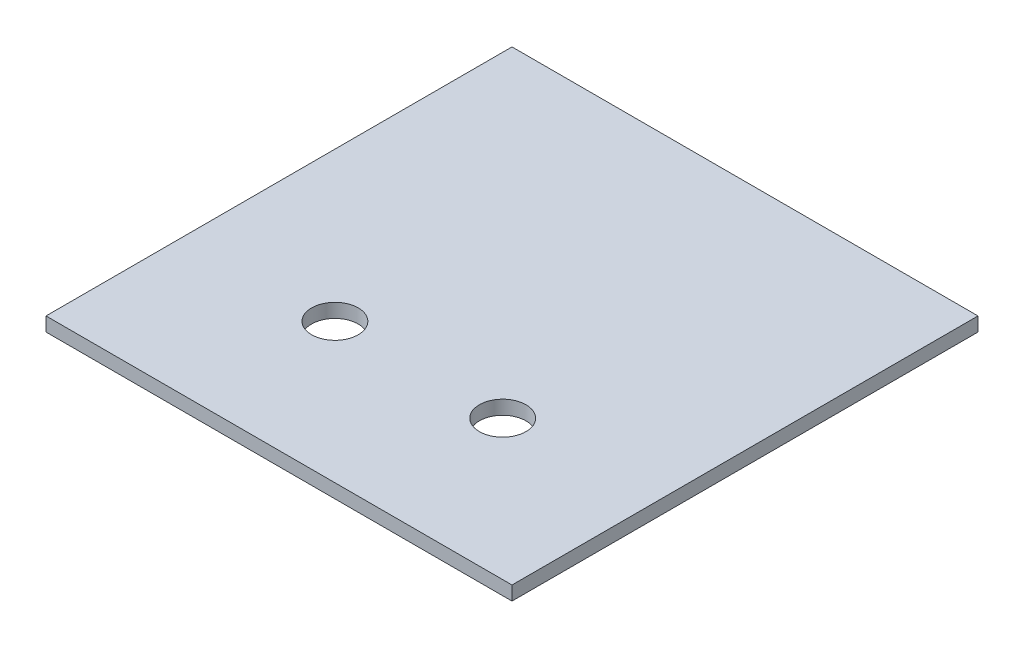
ISO-10303-21;
HEADER;
FILE_DESCRIPTION(('STEP AP214'),'2;1');
FILE_NAME('part.step','',(''),(''),'','','');
FILE_SCHEMA(('AUTOMOTIVE_DESIGN { 1 0 10303 214 1 1 1 1 }'));
ENDSEC;
DATA;
#1=APPLICATION_CONTEXT('core data for automotive mechanical design processes');
#2=APPLICATION_PROTOCOL_DEFINITION('international standard','automotive_design',2000,#1);
#3=PRODUCT_CONTEXT('',#1,'mechanical');
#4=PRODUCT('Part','Part','',(#3));
#5=PRODUCT_RELATED_PRODUCT_CATEGORY('part','',(#4));
#6=PRODUCT_DEFINITION_FORMATION('','',#4);
#7=PRODUCT_DEFINITION_CONTEXT('part definition',#1,'design');
#8=PRODUCT_DEFINITION('design','',#6,#7);
#9=PRODUCT_DEFINITION_SHAPE('','',#8);
#10=(LENGTH_UNIT() NAMED_UNIT(*) SI_UNIT(.MILLI.,.METRE.));
#11=(NAMED_UNIT(*) PLANE_ANGLE_UNIT() SI_UNIT($,.RADIAN.));
#12=(NAMED_UNIT(*) SI_UNIT($,.STERADIAN.) SOLID_ANGLE_UNIT());
#13=UNCERTAINTY_MEASURE_WITH_UNIT(LENGTH_MEASURE(1.E-05),#10,'distance_accuracy_value','');
#14=(GEOMETRIC_REPRESENTATION_CONTEXT(3) GLOBAL_UNCERTAINTY_ASSIGNED_CONTEXT((#13)) GLOBAL_UNIT_ASSIGNED_CONTEXT((#10,
#11,#12)) REPRESENTATION_CONTEXT('',''));
#15=CARTESIAN_POINT('',(0.,0.,0.));
#16=DIRECTION('',(0.,0.,1.));
#17=DIRECTION('',(1.,0.,0.));
#18=AXIS2_PLACEMENT_3D('',#15,#16,#17);
#19=CARTESIAN_POINT('',(25.,1.5,25.));
#20=DIRECTION('',(-1.,0.,0.));
#21=DIRECTION('',(0.,0.,1.));
#22=AXIS2_PLACEMENT_3D('',#19,#20,#21);
#23=PLANE('',#22);
#24=DIRECTION('',(0.,0.,-1.));
#25=VECTOR('',#24,1.);
#26=CARTESIAN_POINT('',(25.,0.,25.));
#27=LINE('',#26,#25);
#28=CARTESIAN_POINT('',(25.,0.,25.));
#29=VERTEX_POINT('',#28);
#30=CARTESIAN_POINT('',(25.,0.,-25.));
#31=VERTEX_POINT('',#30);
#32=EDGE_CURVE('E96',#29,#31,#27,.T.);
#33=ORIENTED_EDGE('',*,*,#32,.T.);
#34=DIRECTION('',(0.,-1.,0.));
#35=VECTOR('',#34,1.);
#36=CARTESIAN_POINT('',(25.,1.5,-25.));
#37=LINE('',#36,#35);
#38=CARTESIAN_POINT('',(25.,1.5,-25.));
#39=VERTEX_POINT('',#38);
#40=EDGE_CURVE('E11',#39,#31,#37,.T.);
#41=ORIENTED_EDGE('',*,*,#40,.F.);
#42=DIRECTION('',(0.,0.,-1.));
#43=VECTOR('',#42,1.);
#44=CARTESIAN_POINT('',(25.,1.5,25.));
#45=LINE('',#44,#43);
#46=CARTESIAN_POINT('',(25.,1.5,25.));
#47=VERTEX_POINT('',#46);
#48=EDGE_CURVE('E84',#47,#39,#45,.T.);
#49=ORIENTED_EDGE('',*,*,#48,.F.);
#50=DIRECTION('',(0.,-1.,0.));
#51=VECTOR('',#50,1.);
#52=CARTESIAN_POINT('',(25.,1.5,25.));
#53=LINE('',#52,#51);
#54=EDGE_CURVE('E92',#47,#29,#53,.T.);
#55=ORIENTED_EDGE('',*,*,#54,.T.);
#56=EDGE_LOOP('',(#33,#41,#49,#55));
#57=FACE_BOUND('',#56,.T.);
#58=ADVANCED_FACE('F33',(#57),#23,.F.);
#59=CARTESIAN_POINT('',(-25.,1.5,-25.));
#60=DIRECTION('',(0.,0.,1.));
#61=DIRECTION('',(1.,0.,0.));
#62=AXIS2_PLACEMENT_3D('',#59,#60,#61);
#63=PLANE('',#62);
#64=DIRECTION('',(-1.,0.,0.));
#65=VECTOR('',#64,1.);
#66=CARTESIAN_POINT('',(-25.,0.,-25.));
#67=LINE('',#66,#65);
#68=CARTESIAN_POINT('',(-25.,0.,-25.));
#69=VERTEX_POINT('',#68);
#70=EDGE_CURVE('E88',#31,#69,#67,.T.);
#71=ORIENTED_EDGE('',*,*,#70,.T.);
#72=DIRECTION('',(0.,-1.,0.));
#73=VECTOR('',#72,1.);
#74=CARTESIAN_POINT('',(-25.,1.5,-25.));
#75=LINE('',#74,#73);
#76=CARTESIAN_POINT('',(-25.,1.5,-25.));
#77=VERTEX_POINT('',#76);
#78=EDGE_CURVE('E41',#77,#69,#75,.T.);
#79=ORIENTED_EDGE('',*,*,#78,.F.);
#80=DIRECTION('',(-1.,0.,0.));
#81=VECTOR('',#80,1.);
#82=CARTESIAN_POINT('',(-25.,1.5,-25.));
#83=LINE('',#82,#81);
#84=EDGE_CURVE('E79',#39,#77,#83,.T.);
#85=ORIENTED_EDGE('',*,*,#84,.F.);
#86=ORIENTED_EDGE('',*,*,#40,.T.);
#87=EDGE_LOOP('',(#71,#79,#85,#86));
#88=FACE_BOUND('',#87,.T.);
#89=ADVANCED_FACE('F87',(#88),#63,.F.);
#90=CARTESIAN_POINT('',(-25.,1.5,25.));
#91=DIRECTION('',(1.,0.,0.));
#92=DIRECTION('',(0.,0.,-1.));
#93=AXIS2_PLACEMENT_3D('',#90,#91,#92);
#94=PLANE('',#93);
#95=DIRECTION('',(0.,0.,1.));
#96=VECTOR('',#95,1.);
#97=CARTESIAN_POINT('',(-25.,0.,25.));
#98=LINE('',#97,#96);
#99=CARTESIAN_POINT('',(-25.,0.,25.));
#100=VERTEX_POINT('',#99);
#101=EDGE_CURVE('E66',#69,#100,#98,.T.);
#102=ORIENTED_EDGE('',*,*,#101,.T.);
#103=DIRECTION('',(0.,-1.,0.));
#104=VECTOR('',#103,1.);
#105=CARTESIAN_POINT('',(-25.,1.5,25.));
#106=LINE('',#105,#104);
#107=CARTESIAN_POINT('',(-25.,1.5,25.));
#108=VERTEX_POINT('',#107);
#109=EDGE_CURVE('E89',#108,#100,#106,.T.);
#110=ORIENTED_EDGE('',*,*,#109,.F.);
#111=DIRECTION('',(0.,0.,1.));
#112=VECTOR('',#111,1.);
#113=CARTESIAN_POINT('',(-25.,1.5,25.));
#114=LINE('',#113,#112);
#115=EDGE_CURVE('E82',#77,#108,#114,.T.);
#116=ORIENTED_EDGE('',*,*,#115,.F.);
#117=ORIENTED_EDGE('',*,*,#78,.T.);
#118=EDGE_LOOP('',(#102,#110,#116,#117));
#119=FACE_BOUND('',#118,.T.);
#120=ADVANCED_FACE('F90',(#119),#94,.F.);
#121=CARTESIAN_POINT('',(-25.,1.5,25.));
#122=DIRECTION('',(0.,0.,-1.));
#123=DIRECTION('',(-1.,0.,0.));
#124=AXIS2_PLACEMENT_3D('',#121,#122,#123);
#125=PLANE('',#124);
#126=DIRECTION('',(1.,0.,0.));
#127=VECTOR('',#126,1.);
#128=CARTESIAN_POINT('',(-25.,0.,25.));
#129=LINE('',#128,#127);
#130=EDGE_CURVE('E72',#100,#29,#129,.T.);
#131=ORIENTED_EDGE('',*,*,#130,.T.);
#132=ORIENTED_EDGE('',*,*,#54,.F.);
#133=DIRECTION('',(1.,0.,0.));
#134=VECTOR('',#133,1.);
#135=CARTESIAN_POINT('',(-25.,1.5,25.));
#136=LINE('',#135,#134);
#137=EDGE_CURVE('E49',#108,#47,#136,.T.);
#138=ORIENTED_EDGE('',*,*,#137,.F.);
#139=ORIENTED_EDGE('',*,*,#109,.T.);
#140=EDGE_LOOP('',(#131,#132,#138,#139));
#141=FACE_BOUND('',#140,.T.);
#142=ADVANCED_FACE('F104',(#141),#125,.F.);
#143=CARTESIAN_POINT('',(0.,1.5,0.));
#144=DIRECTION('',(0.,-1.,0.));
#145=DIRECTION('',(0.,0.,-1.));
#146=AXIS2_PLACEMENT_3D('',#143,#144,#145);
#147=PLANE('',#146);
#148=CARTESIAN_POINT('',(-9.,1.5,10.));
#149=DIRECTION('',(0.,-1.,0.));
#150=DIRECTION('',(0.,0.,1.));
#151=AXIS2_PLACEMENT_3D('',#148,#149,#150);
#152=CIRCLE('',#151,2.5);
#153=CARTESIAN_POINT('',(-9.,1.5,12.5));
#154=VERTEX_POINT('',#153);
#155=EDGE_CURVE('E116',#154,#154,#152,.T.);
#156=ORIENTED_EDGE('',*,*,#155,.T.);
#157=EDGE_LOOP('',(#156));
#158=FACE_BOUND('',#157,.T.);
#159=CARTESIAN_POINT('',(9.,1.5,10.));
#160=DIRECTION('',(0.,1.,0.));
#161=DIRECTION('',(0.,0.,1.));
#162=AXIS2_PLACEMENT_3D('',#159,#160,#161);
#163=CIRCLE('',#162,2.5);
#164=CARTESIAN_POINT('',(9.,1.5,12.5));
#165=VERTEX_POINT('',#164);
#166=EDGE_CURVE('E110',#165,#165,#163,.T.);
#167=ORIENTED_EDGE('',*,*,#166,.F.);
#168=EDGE_LOOP('',(#167));
#169=FACE_BOUND('',#168,.T.);
#170=ORIENTED_EDGE('',*,*,#48,.T.);
#171=ORIENTED_EDGE('',*,*,#84,.T.);
#172=ORIENTED_EDGE('',*,*,#115,.T.);
#173=ORIENTED_EDGE('',*,*,#137,.T.);
#174=EDGE_LOOP('',(#170,#171,#172,#173));
#175=FACE_BOUND('',#174,.T.);
#176=ADVANCED_FACE('F80',(#158,#169,#175),#147,.F.);
#177=CARTESIAN_POINT('',(0.,0.,0.));
#178=DIRECTION('',(0.,-1.,0.));
#179=DIRECTION('',(0.,0.,-1.));
#180=AXIS2_PLACEMENT_3D('',#177,#178,#179);
#181=PLANE('',#180);
#182=CARTESIAN_POINT('',(-9.,0.,10.));
#183=DIRECTION('',(0.,-1.,0.));
#184=DIRECTION('',(0.,0.,1.));
#185=AXIS2_PLACEMENT_3D('',#182,#183,#184);
#186=CIRCLE('',#185,2.5);
#187=CARTESIAN_POINT('',(-9.,0.,12.5));
#188=VERTEX_POINT('',#187);
#189=EDGE_CURVE('E113',#188,#188,#186,.T.);
#190=ORIENTED_EDGE('',*,*,#189,.F.);
#191=EDGE_LOOP('',(#190));
#192=FACE_BOUND('',#191,.T.);
#193=CARTESIAN_POINT('',(9.,0.,10.));
#194=DIRECTION('',(0.,1.,0.));
#195=DIRECTION('',(0.,0.,1.));
#196=AXIS2_PLACEMENT_3D('',#193,#194,#195);
#197=CIRCLE('',#196,2.5);
#198=CARTESIAN_POINT('',(9.,0.,12.5));
#199=VERTEX_POINT('',#198);
#200=EDGE_CURVE('E99',#199,#199,#197,.T.);
#201=ORIENTED_EDGE('',*,*,#200,.T.);
#202=EDGE_LOOP('',(#201));
#203=FACE_BOUND('',#202,.T.);
#204=ORIENTED_EDGE('',*,*,#32,.F.);
#205=ORIENTED_EDGE('',*,*,#130,.F.);
#206=ORIENTED_EDGE('',*,*,#101,.F.);
#207=ORIENTED_EDGE('',*,*,#70,.F.);
#208=EDGE_LOOP('',(#204,#205,#206,#207));
#209=FACE_BOUND('',#208,.T.);
#210=ADVANCED_FACE('F107',(#192,#203,#209),#181,.T.);
#211=CARTESIAN_POINT('',(9.,0.,10.));
#212=DIRECTION('',(0.,1.,0.));
#213=DIRECTION('',(0.,0.,1.));
#214=AXIS2_PLACEMENT_3D('',#211,#212,#213);
#215=CYLINDRICAL_SURFACE('',#214,2.5);
#216=ORIENTED_EDGE('',*,*,#200,.F.);
#217=EDGE_LOOP('',(#216));
#218=FACE_BOUND('',#217,.T.);
#219=ORIENTED_EDGE('',*,*,#166,.T.);
#220=EDGE_LOOP('',(#219));
#221=FACE_BOUND('',#220,.T.);
#222=ADVANCED_FACE('F127',(#218,#221),#215,.F.);
#223=CARTESIAN_POINT('',(-9.,0.,10.));
#224=DIRECTION('',(0.,1.,0.));
#225=DIRECTION('',(0.,0.,1.));
#226=AXIS2_PLACEMENT_3D('',#223,#224,#225);
#227=CYLINDRICAL_SURFACE('',#226,2.5);
#228=ORIENTED_EDGE('',*,*,#189,.T.);
#229=EDGE_LOOP('',(#228));
#230=FACE_BOUND('',#229,.T.);
#231=ORIENTED_EDGE('',*,*,#155,.F.);
#232=EDGE_LOOP('',(#231));
#233=FACE_BOUND('',#232,.T.);
#234=ADVANCED_FACE('F122',(#230,#233),#227,.F.);
#235=CLOSED_SHELL('',(#58,#89,#120,#142,#176,#210,#222,#234));
#236=MANIFOLD_SOLID_BREP('B2',#235);
#237=ADVANCED_BREP_SHAPE_REPRESENTATION('',(#18,#236),#14);
#238=SHAPE_DEFINITION_REPRESENTATION(#9,#237);
ENDSEC;
END-ISO-10303-21;
